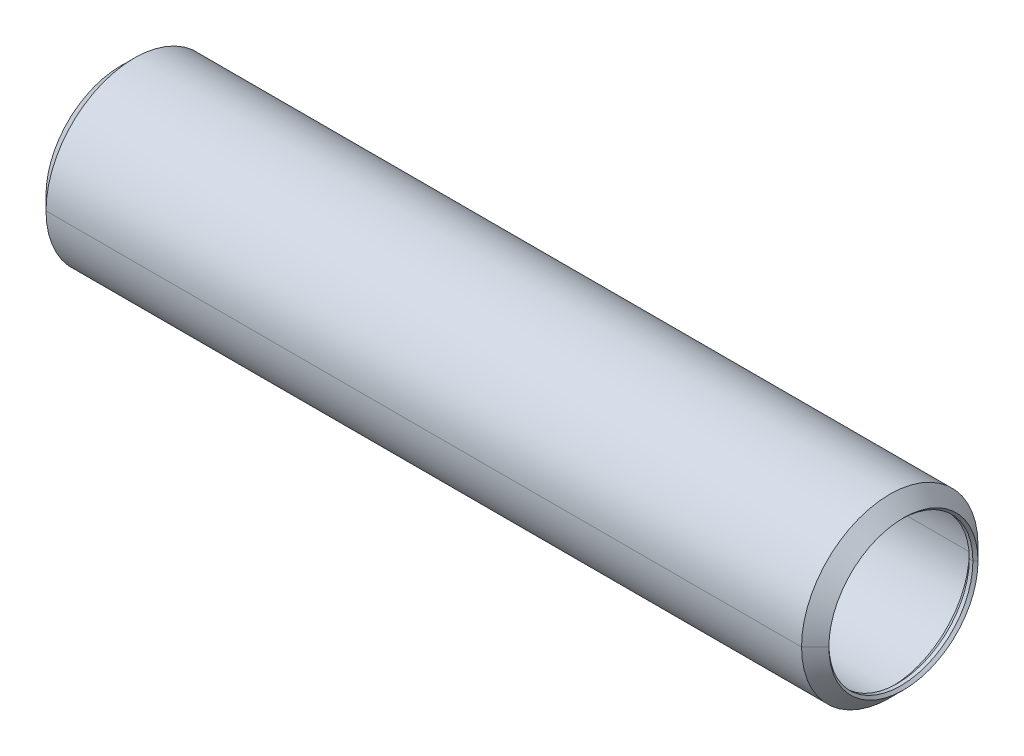
ISO-10303-21;
HEADER;
FILE_DESCRIPTION(('STEP AP214'),'2;1');
FILE_NAME('part.step','',(''),(''),'','','');
FILE_SCHEMA(('AUTOMOTIVE_DESIGN { 1 0 10303 214 1 1 1 1 }'));
ENDSEC;
DATA;
#1=APPLICATION_CONTEXT('core data for automotive mechanical design processes');
#2=APPLICATION_PROTOCOL_DEFINITION('international standard','automotive_design',2000,#1);
#3=PRODUCT_CONTEXT('',#1,'mechanical');
#4=PRODUCT('Part','Part','',(#3));
#5=PRODUCT_RELATED_PRODUCT_CATEGORY('part','',(#4));
#6=PRODUCT_DEFINITION_FORMATION('','',#4);
#7=PRODUCT_DEFINITION_CONTEXT('part definition',#1,'design');
#8=PRODUCT_DEFINITION('design','',#6,#7);
#9=PRODUCT_DEFINITION_SHAPE('','',#8);
#10=(LENGTH_UNIT() NAMED_UNIT(*) SI_UNIT(.MILLI.,.METRE.));
#11=(NAMED_UNIT(*) PLANE_ANGLE_UNIT() SI_UNIT($,.RADIAN.));
#12=(NAMED_UNIT(*) SI_UNIT($,.STERADIAN.) SOLID_ANGLE_UNIT());
#13=UNCERTAINTY_MEASURE_WITH_UNIT(LENGTH_MEASURE(1.E-05),#10,'distance_accuracy_value','');
#14=(GEOMETRIC_REPRESENTATION_CONTEXT(3) GLOBAL_UNCERTAINTY_ASSIGNED_CONTEXT((#13)) GLOBAL_UNIT_ASSIGNED_CONTEXT((#10,
#11,#12)) REPRESENTATION_CONTEXT('',''));
#15=CARTESIAN_POINT('',(0.,0.,0.));
#16=DIRECTION('',(0.,0.,1.));
#17=DIRECTION('',(1.,0.,0.));
#18=AXIS2_PLACEMENT_3D('',#15,#16,#17);
#19=CARTESIAN_POINT('',(1.69096926547172,0.,0.));
#20=DIRECTION('',(1.,0.,0.));
#21=DIRECTION('',(0.,1.,0.));
#22=AXIS2_PLACEMENT_3D('',#19,#20,#21);
#23=CONICAL_SURFACE('',#22,10.922,0.785398163397444);
#24=CARTESIAN_POINT('',(0.,0.,0.));
#25=DIRECTION('',(1.,0.,0.));
#26=DIRECTION('',(0.,0.,-1.));
#27=AXIS2_PLACEMENT_3D('',#24,#25,#26);
#28=CIRCLE('',#27,9.2310307345283);
#29=CARTESIAN_POINT('',(0.,0.,9.2310307345283));
#30=VERTEX_POINT('',#29);
#31=CARTESIAN_POINT('',(0.,0.,-9.2310307345283));
#32=VERTEX_POINT('',#31);
#33=EDGE_CURVE('E10',#30,#32,#28,.T.);
#34=ORIENTED_EDGE('',*,*,#33,.T.);
#35=CARTESIAN_POINT('',(0.,0.,-9.2310307345283));
#36=DIRECTION('',(0.707106781186551,0.,-0.707106781186544));
#37=VECTOR('',#36,1.);
#38=LINE('',#35,#37);
#39=CARTESIAN_POINT('',(1.69096926547172,0.,-10.922));
#40=VERTEX_POINT('',#39);
#41=EDGE_CURVE('E25',#32,#40,#38,.T.);
#42=ORIENTED_EDGE('',*,*,#41,.T.);
#43=CARTESIAN_POINT('',(1.69096926547172,0.,0.));
#44=DIRECTION('',(1.,0.,0.));
#45=DIRECTION('',(0.,0.,-1.));
#46=AXIS2_PLACEMENT_3D('',#43,#44,#45);
#47=CIRCLE('',#46,10.922);
#48=CARTESIAN_POINT('',(1.69096926547172,0.,10.922));
#49=VERTEX_POINT('',#48);
#50=EDGE_CURVE('E607',#49,#40,#47,.T.);
#51=ORIENTED_EDGE('',*,*,#50,.F.);
#52=CARTESIAN_POINT('',(0.,0.,9.2310307345283));
#53=DIRECTION('',(0.707106781186551,0.,0.707106781186544));
#54=VECTOR('',#53,1.);
#55=LINE('',#52,#54);
#56=EDGE_CURVE('E595',#30,#49,#55,.T.);
#57=ORIENTED_EDGE('',*,*,#56,.F.);
#58=EDGE_LOOP('',(#34,#42,#51,#57));
#59=FACE_BOUND('',#58,.T.);
#60=ADVANCED_FACE('F16',(#59),#23,.T.);
#61=CARTESIAN_POINT('',(1.69096926547172,0.,0.));
#62=DIRECTION('',(1.,0.,0.));
#63=DIRECTION('',(0.,-1.,0.));
#64=AXIS2_PLACEMENT_3D('',#61,#62,#63);
#65=CONICAL_SURFACE('',#64,10.922,0.785398163397444);
#66=CARTESIAN_POINT('',(1.69096926547172,0.,0.));
#67=DIRECTION('',(1.,0.,0.));
#68=DIRECTION('',(0.,0.,-1.));
#69=AXIS2_PLACEMENT_3D('',#66,#67,#68);
#70=CIRCLE('',#69,10.922);
#71=EDGE_CURVE('E121',#40,#49,#70,.T.);
#72=ORIENTED_EDGE('',*,*,#71,.F.);
#73=ORIENTED_EDGE('',*,*,#41,.F.);
#74=CARTESIAN_POINT('',(0.,0.,0.));
#75=DIRECTION('',(1.,0.,0.));
#76=DIRECTION('',(0.,0.,-1.));
#77=AXIS2_PLACEMENT_3D('',#74,#75,#76);
#78=CIRCLE('',#77,9.2310307345283);
#79=EDGE_CURVE('E563',#32,#30,#78,.T.);
#80=ORIENTED_EDGE('',*,*,#79,.T.);
#81=ORIENTED_EDGE('',*,*,#56,.T.);
#82=EDGE_LOOP('',(#72,#73,#80,#81));
#83=FACE_BOUND('',#82,.T.);
#84=ADVANCED_FACE('F571',(#83),#65,.T.);
#85=CARTESIAN_POINT('',(0.,0.,0.));
#86=DIRECTION('',(-1.,0.,0.));
#87=DIRECTION('',(0.,-1.,0.));
#88=AXIS2_PLACEMENT_3D('',#85,#86,#87);
#89=CONICAL_SURFACE('',#88,9.2310307345283,0.785398163397432);
#90=CARTESIAN_POINT('',(0.31563073452831,0.,0.));
#91=DIRECTION('',(1.,0.,0.));
#92=DIRECTION('',(0.,0.,-1.));
#93=AXIS2_PLACEMENT_3D('',#90,#91,#92);
#94=CIRCLE('',#93,8.9154);
#95=CARTESIAN_POINT('',(0.31563073452831,0.,-8.9154));
#96=VERTEX_POINT('',#95);
#97=CARTESIAN_POINT('',(0.315630734528312,0.,8.9154));
#98=VERTEX_POINT('',#97);
#99=EDGE_CURVE('E561',#96,#98,#94,.T.);
#100=ORIENTED_EDGE('',*,*,#99,.T.);
#101=CARTESIAN_POINT('',(0.315630734528312,0.,8.9154));
#102=DIRECTION('',(-0.707106781186559,0.,0.707106781186536));
#103=VECTOR('',#102,1.);
#104=LINE('',#101,#103);
#105=EDGE_CURVE('E539',#98,#30,#104,.T.);
#106=ORIENTED_EDGE('',*,*,#105,.T.);
#107=ORIENTED_EDGE('',*,*,#79,.F.);
#108=CARTESIAN_POINT('',(0.315630734528312,0.,-8.9154));
#109=DIRECTION('',(-0.707106781186559,0.,-0.707106781186536));
#110=VECTOR('',#109,1.);
#111=LINE('',#108,#110);
#112=EDGE_CURVE('E551',#96,#32,#111,.T.);
#113=ORIENTED_EDGE('',*,*,#112,.F.);
#114=EDGE_LOOP('',(#100,#106,#107,#113));
#115=FACE_BOUND('',#114,.T.);
#116=ADVANCED_FACE('F520',(#115),#89,.F.);
#117=CARTESIAN_POINT('',(0.,0.,0.));
#118=DIRECTION('',(-1.,0.,0.));
#119=DIRECTION('',(0.,1.,0.));
#120=AXIS2_PLACEMENT_3D('',#117,#118,#119);
#121=CONICAL_SURFACE('',#120,9.2310307345283,0.785398163397432);
#122=ORIENTED_EDGE('',*,*,#33,.F.);
#123=ORIENTED_EDGE('',*,*,#105,.F.);
#124=CARTESIAN_POINT('',(0.31563073452831,0.,0.));
#125=DIRECTION('',(1.,0.,0.));
#126=DIRECTION('',(0.,0.,-1.));
#127=AXIS2_PLACEMENT_3D('',#124,#125,#126);
#128=CIRCLE('',#127,8.9154);
#129=EDGE_CURVE('E618',#98,#96,#128,.T.);
#130=ORIENTED_EDGE('',*,*,#129,.T.);
#131=ORIENTED_EDGE('',*,*,#112,.T.);
#132=EDGE_LOOP('',(#122,#123,#130,#131));
#133=FACE_BOUND('',#132,.T.);
#134=ADVANCED_FACE('F511',(#133),#121,.F.);
#135=CARTESIAN_POINT('',(193.8274,0.,0.));
#136=DIRECTION('',(-1.,0.,0.));
#137=DIRECTION('',(0.,1.,0.));
#138=AXIS2_PLACEMENT_3D('',#135,#136,#137);
#139=CYLINDRICAL_SURFACE('',#138,8.9154);
#140=ORIENTED_EDGE('',*,*,#129,.F.);
#141=CARTESIAN_POINT('',(0.761999999999985,0.,8.9154));
#142=DIRECTION('',(-1.,0.,0.));
#143=VECTOR('',#142,1.);
#144=LINE('',#141,#143);
#145=CARTESIAN_POINT('',(0.762,0.,8.9154));
#146=VERTEX_POINT('',#145);
#147=EDGE_CURVE('E476',#146,#98,#144,.T.);
#148=ORIENTED_EDGE('',*,*,#147,.F.);
#149=CARTESIAN_POINT('',(0.762000000000013,0.,0.));
#150=DIRECTION('',(1.,0.,0.));
#151=DIRECTION('',(0.,0.,-1.));
#152=AXIS2_PLACEMENT_3D('',#149,#150,#151);
#153=CIRCLE('',#152,8.9154);
#154=CARTESIAN_POINT('',(0.762000000000013,0.,-8.9154));
#155=VERTEX_POINT('',#154);
#156=EDGE_CURVE('E493',#146,#155,#153,.T.);
#157=ORIENTED_EDGE('',*,*,#156,.T.);
#158=CARTESIAN_POINT('',(0.761999999999985,0.,-8.9154));
#159=DIRECTION('',(-1.,0.,0.));
#160=VECTOR('',#159,1.);
#161=LINE('',#158,#160);
#162=EDGE_CURVE('E478',#155,#96,#161,.T.);
#163=ORIENTED_EDGE('',*,*,#162,.T.);
#164=EDGE_LOOP('',(#140,#148,#157,#163));
#165=FACE_BOUND('',#164,.T.);
#166=ADVANCED_FACE('F459',(#165),#139,.F.);
#167=CARTESIAN_POINT('',(193.8274,0.,0.));
#168=DIRECTION('',(-1.,0.,0.));
#169=DIRECTION('',(0.,-1.,0.));
#170=AXIS2_PLACEMENT_3D('',#167,#168,#169);
#171=CYLINDRICAL_SURFACE('',#170,8.9154);
#172=CARTESIAN_POINT('',(0.762000000000013,0.,0.));
#173=DIRECTION('',(1.,0.,0.));
#174=DIRECTION('',(0.,0.,-1.));
#175=AXIS2_PLACEMENT_3D('',#172,#173,#174);
#176=CIRCLE('',#175,8.9154);
#177=EDGE_CURVE('E442',#155,#146,#176,.T.);
#178=ORIENTED_EDGE('',*,*,#177,.T.);
#179=ORIENTED_EDGE('',*,*,#147,.T.);
#180=ORIENTED_EDGE('',*,*,#99,.F.);
#181=ORIENTED_EDGE('',*,*,#162,.F.);
#182=EDGE_LOOP('',(#178,#179,#180,#181));
#183=FACE_BOUND('',#182,.T.);
#184=ADVANCED_FACE('F450',(#183),#171,.F.);
#185=CARTESIAN_POINT('',(0.762000000000013,0.,0.));
#186=DIRECTION('',(1.,0.,0.));
#187=DIRECTION('',(0.,-1.,0.));
#188=AXIS2_PLACEMENT_3D('',#185,#186,#187);
#189=CONICAL_SURFACE('',#188,8.9154,0.785398163397459);
#190=CARTESIAN_POINT('',(1.524,0.,0.));
#191=DIRECTION('',(1.,0.,0.));
#192=DIRECTION('',(0.,0.,-1.));
#193=AXIS2_PLACEMENT_3D('',#190,#191,#192);
#194=CIRCLE('',#193,9.6774);
#195=CARTESIAN_POINT('',(1.524,0.,-9.6774));
#196=VERTEX_POINT('',#195);
#197=CARTESIAN_POINT('',(1.524,0.,9.6774));
#198=VERTEX_POINT('',#197);
#199=EDGE_CURVE('E440',#196,#198,#194,.T.);
#200=ORIENTED_EDGE('',*,*,#199,.T.);
#201=CARTESIAN_POINT('',(0.762000000000013,0.,8.9154));
#202=DIRECTION('',(0.70710678118654,0.,0.707106781186555));
#203=VECTOR('',#202,1.);
#204=LINE('',#201,#203);
#205=EDGE_CURVE('E418',#146,#198,#204,.T.);
#206=ORIENTED_EDGE('',*,*,#205,.F.);
#207=ORIENTED_EDGE('',*,*,#177,.F.);
#208=CARTESIAN_POINT('',(0.762000000000013,0.,-8.9154));
#209=DIRECTION('',(0.70710678118654,0.,-0.707106781186555));
#210=VECTOR('',#209,1.);
#211=LINE('',#208,#210);
#212=EDGE_CURVE('E430',#155,#196,#211,.T.);
#213=ORIENTED_EDGE('',*,*,#212,.T.);
#214=EDGE_LOOP('',(#200,#206,#207,#213));
#215=FACE_BOUND('',#214,.T.);
#216=ADVANCED_FACE('F397',(#215),#189,.F.);
#217=CARTESIAN_POINT('',(0.762000000000013,0.,0.));
#218=DIRECTION('',(1.,0.,0.));
#219=DIRECTION('',(0.,1.,0.));
#220=AXIS2_PLACEMENT_3D('',#217,#218,#219);
#221=CONICAL_SURFACE('',#220,8.9154,0.785398163397459);
#222=ORIENTED_EDGE('',*,*,#156,.F.);
#223=ORIENTED_EDGE('',*,*,#205,.T.);
#224=CARTESIAN_POINT('',(1.524,0.,0.));
#225=DIRECTION('',(1.,0.,0.));
#226=DIRECTION('',(0.,0.,-1.));
#227=AXIS2_PLACEMENT_3D('',#224,#225,#226);
#228=CIRCLE('',#227,9.6774);
#229=EDGE_CURVE('E866',#198,#196,#228,.T.);
#230=ORIENTED_EDGE('',*,*,#229,.T.);
#231=ORIENTED_EDGE('',*,*,#212,.F.);
#232=EDGE_LOOP('',(#222,#223,#230,#231));
#233=FACE_BOUND('',#232,.T.);
#234=ADVANCED_FACE('F388',(#233),#221,.F.);
#235=CARTESIAN_POINT('',(193.8274,0.,0.));
#236=DIRECTION('',(-1.,0.,0.));
#237=DIRECTION('',(0.,1.,0.));
#238=AXIS2_PLACEMENT_3D('',#235,#236,#237);
#239=CYLINDRICAL_SURFACE('',#238,9.6774);
#240=ORIENTED_EDGE('',*,*,#229,.F.);
#241=CARTESIAN_POINT('',(95.3897,0.,9.6774));
#242=DIRECTION('',(-1.,0.,0.));
#243=VECTOR('',#242,1.);
#244=LINE('',#241,#243);
#245=CARTESIAN_POINT('',(95.3897,0.,9.6774));
#246=VERTEX_POINT('',#245);
#247=EDGE_CURVE('E353',#246,#198,#244,.T.);
#248=ORIENTED_EDGE('',*,*,#247,.F.);
#249=CARTESIAN_POINT('',(95.3897,0.,0.));
#250=DIRECTION('',(1.,0.,0.));
#251=DIRECTION('',(0.,0.,-1.));
#252=AXIS2_PLACEMENT_3D('',#249,#250,#251);
#253=CIRCLE('',#252,9.6774);
#254=CARTESIAN_POINT('',(95.3897,0.,-9.6774));
#255=VERTEX_POINT('',#254);
#256=EDGE_CURVE('E370',#246,#255,#253,.T.);
#257=ORIENTED_EDGE('',*,*,#256,.T.);
#258=CARTESIAN_POINT('',(95.3897,0.,-9.6774));
#259=DIRECTION('',(-1.,0.,0.));
#260=VECTOR('',#259,1.);
#261=LINE('',#258,#260);
#262=EDGE_CURVE('E355',#255,#196,#261,.T.);
#263=ORIENTED_EDGE('',*,*,#262,.T.);
#264=EDGE_LOOP('',(#240,#248,#257,#263));
#265=FACE_BOUND('',#264,.T.);
#266=ADVANCED_FACE('F336',(#265),#239,.F.);
#267=CARTESIAN_POINT('',(193.8274,0.,0.));
#268=DIRECTION('',(-1.,0.,0.));
#269=DIRECTION('',(0.,-1.,0.));
#270=AXIS2_PLACEMENT_3D('',#267,#268,#269);
#271=CYLINDRICAL_SURFACE('',#270,9.6774);
#272=CARTESIAN_POINT('',(95.3897,0.,0.));
#273=DIRECTION('',(1.,0.,0.));
#274=DIRECTION('',(0.,0.,-1.));
#275=AXIS2_PLACEMENT_3D('',#272,#273,#274);
#276=CIRCLE('',#275,9.6774);
#277=EDGE_CURVE('E319',#255,#246,#276,.T.);
#278=ORIENTED_EDGE('',*,*,#277,.T.);
#279=ORIENTED_EDGE('',*,*,#247,.T.);
#280=ORIENTED_EDGE('',*,*,#199,.F.);
#281=ORIENTED_EDGE('',*,*,#262,.F.);
#282=EDGE_LOOP('',(#278,#279,#280,#281));
#283=FACE_BOUND('',#282,.T.);
#284=ADVANCED_FACE('F327',(#283),#271,.F.);
#285=CARTESIAN_POINT('',(95.3897,0.,0.));
#286=DIRECTION('',(-1.,0.,0.));
#287=DIRECTION('',(0.,-1.,0.));
#288=AXIS2_PLACEMENT_3D('',#285,#286,#287);
#289=CONICAL_SURFACE('',#288,9.6774,0.78539816339745);
#290=CARTESIAN_POINT('',(96.1517,0.,0.));
#291=DIRECTION('',(1.,0.,0.));
#292=DIRECTION('',(0.,0.,-1.));
#293=AXIS2_PLACEMENT_3D('',#290,#291,#292);
#294=CIRCLE('',#293,8.9154);
#295=CARTESIAN_POINT('',(96.1517,0.,-8.9154));
#296=VERTEX_POINT('',#295);
#297=CARTESIAN_POINT('',(96.1517,0.,8.9154));
#298=VERTEX_POINT('',#297);
#299=EDGE_CURVE('E317',#296,#298,#294,.T.);
#300=ORIENTED_EDGE('',*,*,#299,.T.);
#301=CARTESIAN_POINT('',(96.1517,0.,8.9154));
#302=DIRECTION('',(-0.707106781186546,0.,0.707106781186549));
#303=VECTOR('',#302,1.);
#304=LINE('',#301,#303);
#305=EDGE_CURVE('E295',#298,#246,#304,.T.);
#306=ORIENTED_EDGE('',*,*,#305,.T.);
#307=ORIENTED_EDGE('',*,*,#277,.F.);
#308=CARTESIAN_POINT('',(96.1517,0.,-8.9154));
#309=DIRECTION('',(-0.707106781186546,0.,-0.707106781186549));
#310=VECTOR('',#309,1.);
#311=LINE('',#308,#310);
#312=EDGE_CURVE('E307',#296,#255,#311,.T.);
#313=ORIENTED_EDGE('',*,*,#312,.F.);
#314=EDGE_LOOP('',(#300,#306,#307,#313));
#315=FACE_BOUND('',#314,.T.);
#316=ADVANCED_FACE('F274',(#315),#289,.F.);
#317=CARTESIAN_POINT('',(95.3897,0.,0.));
#318=DIRECTION('',(-1.,0.,0.));
#319=DIRECTION('',(0.,1.,0.));
#320=AXIS2_PLACEMENT_3D('',#317,#318,#319);
#321=CONICAL_SURFACE('',#320,9.6774,0.78539816339745);
#322=ORIENTED_EDGE('',*,*,#256,.F.);
#323=ORIENTED_EDGE('',*,*,#305,.F.);
#324=CARTESIAN_POINT('',(96.1517,0.,0.));
#325=DIRECTION('',(1.,0.,0.));
#326=DIRECTION('',(0.,0.,-1.));
#327=AXIS2_PLACEMENT_3D('',#324,#325,#326);
#328=CIRCLE('',#327,8.9154);
#329=EDGE_CURVE('E865',#298,#296,#328,.T.);
#330=ORIENTED_EDGE('',*,*,#329,.T.);
#331=ORIENTED_EDGE('',*,*,#312,.T.);
#332=EDGE_LOOP('',(#322,#323,#330,#331));
#333=FACE_BOUND('',#332,.T.);
#334=ADVANCED_FACE('F265',(#333),#321,.F.);
#335=CARTESIAN_POINT('',(193.8274,0.,0.));
#336=DIRECTION('',(-1.,0.,0.));
#337=DIRECTION('',(0.,1.,0.));
#338=AXIS2_PLACEMENT_3D('',#335,#336,#337);
#339=CYLINDRICAL_SURFACE('',#338,8.9154);
#340=ORIENTED_EDGE('',*,*,#329,.F.);
#341=CARTESIAN_POINT('',(96.598069265472,0.,8.9154));
#342=DIRECTION('',(-1.,0.,0.));
#343=VECTOR('',#342,1.);
#344=LINE('',#341,#343);
#345=CARTESIAN_POINT('',(96.598069265472,0.,8.9154));
#346=VERTEX_POINT('',#345);
#347=EDGE_CURVE('E230',#346,#298,#344,.T.);
#348=ORIENTED_EDGE('',*,*,#347,.F.);
#349=CARTESIAN_POINT('',(96.598069265472,0.,0.));
#350=DIRECTION('',(1.,0.,0.));
#351=DIRECTION('',(0.,0.,-1.));
#352=AXIS2_PLACEMENT_3D('',#349,#350,#351);
#353=CIRCLE('',#352,8.9154);
#354=CARTESIAN_POINT('',(96.598069265472,0.,-8.9154));
#355=VERTEX_POINT('',#354);
#356=EDGE_CURVE('E247',#346,#355,#353,.T.);
#357=ORIENTED_EDGE('',*,*,#356,.T.);
#358=CARTESIAN_POINT('',(96.598069265472,0.,-8.9154));
#359=DIRECTION('',(-1.,0.,0.));
#360=VECTOR('',#359,1.);
#361=LINE('',#358,#360);
#362=EDGE_CURVE('E232',#355,#296,#361,.T.);
#363=ORIENTED_EDGE('',*,*,#362,.T.);
#364=EDGE_LOOP('',(#340,#348,#357,#363));
#365=FACE_BOUND('',#364,.T.);
#366=ADVANCED_FACE('F213',(#365),#339,.F.);
#367=CARTESIAN_POINT('',(193.8274,0.,0.));
#368=DIRECTION('',(-1.,0.,0.));
#369=DIRECTION('',(0.,-1.,0.));
#370=AXIS2_PLACEMENT_3D('',#367,#368,#369);
#371=CYLINDRICAL_SURFACE('',#370,8.9154);
#372=CARTESIAN_POINT('',(96.598069265472,0.,0.));
#373=DIRECTION('',(1.,0.,0.));
#374=DIRECTION('',(0.,0.,-1.));
#375=AXIS2_PLACEMENT_3D('',#372,#373,#374);
#376=CIRCLE('',#375,8.9154);
#377=EDGE_CURVE('E196',#355,#346,#376,.T.);
#378=ORIENTED_EDGE('',*,*,#377,.T.);
#379=ORIENTED_EDGE('',*,*,#347,.T.);
#380=ORIENTED_EDGE('',*,*,#299,.F.);
#381=ORIENTED_EDGE('',*,*,#362,.F.);
#382=EDGE_LOOP('',(#378,#379,#380,#381));
#383=FACE_BOUND('',#382,.T.);
#384=ADVANCED_FACE('F204',(#383),#371,.F.);
#385=CARTESIAN_POINT('',(96.598069265472,0.,0.));
#386=DIRECTION('',(1.,0.,0.));
#387=DIRECTION('',(0.,-1.,0.));
#388=AXIS2_PLACEMENT_3D('',#385,#386,#387);
#389=CONICAL_SURFACE('',#388,8.9154,0.785398163397937);
#390=CARTESIAN_POINT('',(96.9137,0.,0.));
#391=DIRECTION('',(1.,0.,0.));
#392=DIRECTION('',(0.,0.,-1.));
#393=AXIS2_PLACEMENT_3D('',#390,#391,#392);
#394=CIRCLE('',#393,9.2310307345283);
#395=CARTESIAN_POINT('',(96.9137,0.,-9.2310307345283));
#396=VERTEX_POINT('',#395);
#397=CARTESIAN_POINT('',(96.9137,0.,9.23103073452828));
#398=VERTEX_POINT('',#397);
#399=EDGE_CURVE('E194',#396,#398,#394,.T.);
#400=ORIENTED_EDGE('',*,*,#399,.T.);
#401=CARTESIAN_POINT('',(96.598069265472,0.,8.9154));
#402=DIRECTION('',(0.707106781186204,0.,0.707106781186892));
#403=VECTOR('',#402,1.);
#404=LINE('',#401,#403);
#405=EDGE_CURVE('E173',#346,#398,#404,.T.);
#406=ORIENTED_EDGE('',*,*,#405,.F.);
#407=ORIENTED_EDGE('',*,*,#377,.F.);
#408=CARTESIAN_POINT('',(96.598069265472,0.,-8.9154));
#409=DIRECTION('',(0.707106781186204,0.,-0.707106781186892));
#410=VECTOR('',#409,1.);
#411=LINE('',#408,#410);
#412=EDGE_CURVE('E130',#355,#396,#411,.T.);
#413=ORIENTED_EDGE('',*,*,#412,.T.);
#414=EDGE_LOOP('',(#400,#406,#407,#413));
#415=FACE_BOUND('',#414,.T.);
#416=ADVANCED_FACE('F151',(#415),#389,.F.);
#417=CARTESIAN_POINT('',(96.598069265472,0.,0.));
#418=DIRECTION('',(1.,0.,0.));
#419=DIRECTION('',(0.,1.,0.));
#420=AXIS2_PLACEMENT_3D('',#417,#418,#419);
#421=CONICAL_SURFACE('',#420,8.9154,0.785398163397937);
#422=ORIENTED_EDGE('',*,*,#356,.F.);
#423=ORIENTED_EDGE('',*,*,#405,.T.);
#424=CARTESIAN_POINT('',(96.9137,0.,0.));
#425=DIRECTION('',(1.,0.,0.));
#426=DIRECTION('',(0.,0.,-1.));
#427=AXIS2_PLACEMENT_3D('',#424,#425,#426);
#428=CIRCLE('',#427,9.2310307345283);
#429=EDGE_CURVE('E99',#398,#396,#428,.T.);
#430=ORIENTED_EDGE('',*,*,#429,.T.);
#431=ORIENTED_EDGE('',*,*,#412,.F.);
#432=EDGE_LOOP('',(#422,#423,#430,#431));
#433=FACE_BOUND('',#432,.T.);
#434=ADVANCED_FACE('F141',(#433),#421,.F.);
#435=CARTESIAN_POINT('',(96.9137,0.,0.));
#436=DIRECTION('',(-1.,0.,0.));
#437=DIRECTION('',(0.,1.,0.));
#438=AXIS2_PLACEMENT_3D('',#435,#436,#437);
#439=CONICAL_SURFACE('',#438,9.2310307345283,0.785398163397358);
#440=CARTESIAN_POINT('',(95.222730734528,0.,0.));
#441=DIRECTION('',(1.,0.,0.));
#442=DIRECTION('',(0.,0.,-1.));
#443=AXIS2_PLACEMENT_3D('',#440,#441,#442);
#444=CIRCLE('',#443,10.922);
#445=CARTESIAN_POINT('',(95.222730734528,0.,10.922));
#446=VERTEX_POINT('',#445);
#447=CARTESIAN_POINT('',(95.222730734528,0.,-10.922));
#448=VERTEX_POINT('',#447);
#449=EDGE_CURVE('E96',#446,#448,#444,.T.);
#450=ORIENTED_EDGE('',*,*,#449,.T.);
#451=CARTESIAN_POINT('',(96.9137,0.,-9.2310307345283));
#452=DIRECTION('',(-0.707106781186612,0.,-0.707106781186483));
#453=VECTOR('',#452,1.);
#454=LINE('',#451,#453);
#455=EDGE_CURVE('E103',#396,#448,#454,.T.);
#456=ORIENTED_EDGE('',*,*,#455,.F.);
#457=ORIENTED_EDGE('',*,*,#429,.F.);
#458=CARTESIAN_POINT('',(96.9137,0.,9.2310307345283));
#459=DIRECTION('',(-0.707106781186612,0.,0.707106781186483));
#460=VECTOR('',#459,1.);
#461=LINE('',#458,#460);
#462=EDGE_CURVE('E90',#398,#446,#461,.T.);
#463=ORIENTED_EDGE('',*,*,#462,.T.);
#464=EDGE_LOOP('',(#450,#456,#457,#463));
#465=FACE_BOUND('',#464,.T.);
#466=ADVANCED_FACE('F93',(#465),#439,.T.);
#467=CARTESIAN_POINT('',(96.9137,0.,0.));
#468=DIRECTION('',(-1.,0.,0.));
#469=DIRECTION('',(0.,-1.,0.));
#470=AXIS2_PLACEMENT_3D('',#467,#468,#469);
#471=CONICAL_SURFACE('',#470,9.2310307345283,0.785398163397358);
#472=ORIENTED_EDGE('',*,*,#399,.F.);
#473=ORIENTED_EDGE('',*,*,#455,.T.);
#474=CARTESIAN_POINT('',(95.222730734528,0.,0.));
#475=DIRECTION('',(1.,0.,0.));
#476=DIRECTION('',(0.,0.,-1.));
#477=AXIS2_PLACEMENT_3D('',#474,#475,#476);
#478=CIRCLE('',#477,10.922);
#479=EDGE_CURVE('E104',#448,#446,#478,.T.);
#480=ORIENTED_EDGE('',*,*,#479,.T.);
#481=ORIENTED_EDGE('',*,*,#462,.F.);
#482=EDGE_LOOP('',(#472,#473,#480,#481));
#483=FACE_BOUND('',#482,.T.);
#484=ADVANCED_FACE('F109',(#483),#471,.T.);
#485=CARTESIAN_POINT('',(193.8274,0.,0.));
#486=DIRECTION('',(-1.,0.,0.));
#487=DIRECTION('',(0.,-1.,0.));
#488=AXIS2_PLACEMENT_3D('',#485,#486,#487);
#489=CYLINDRICAL_SURFACE('',#488,10.922);
#490=ORIENTED_EDGE('',*,*,#479,.F.);
#491=CARTESIAN_POINT('',(95.222730734528,0.,-10.922));
#492=DIRECTION('',(-1.,0.,0.));
#493=VECTOR('',#492,1.);
#494=LINE('',#491,#493);
#495=EDGE_CURVE('E114',#448,#40,#494,.T.);
#496=ORIENTED_EDGE('',*,*,#495,.T.);
#497=ORIENTED_EDGE('',*,*,#71,.T.);
#498=CARTESIAN_POINT('',(95.222730734528,0.,10.922));
#499=DIRECTION('',(-1.,0.,0.));
#500=VECTOR('',#499,1.);
#501=LINE('',#498,#500);
#502=EDGE_CURVE('E118',#446,#49,#501,.T.);
#503=ORIENTED_EDGE('',*,*,#502,.F.);
#504=EDGE_LOOP('',(#490,#496,#497,#503));
#505=FACE_BOUND('',#504,.T.);
#506=ADVANCED_FACE('F120',(#505),#489,.T.);
#507=CARTESIAN_POINT('',(193.8274,0.,0.));
#508=DIRECTION('',(-1.,0.,0.));
#509=DIRECTION('',(0.,1.,0.));
#510=AXIS2_PLACEMENT_3D('',#507,#508,#509);
#511=CYLINDRICAL_SURFACE('',#510,10.922);
#512=ORIENTED_EDGE('',*,*,#50,.T.);
#513=ORIENTED_EDGE('',*,*,#495,.F.);
#514=ORIENTED_EDGE('',*,*,#449,.F.);
#515=ORIENTED_EDGE('',*,*,#502,.T.);
#516=EDGE_LOOP('',(#512,#513,#514,#515));
#517=FACE_BOUND('',#516,.T.);
#518=ADVANCED_FACE('F127',(#517),#511,.T.);
#519=CLOSED_SHELL('',(#60,#84,#116,#134,#166,#184,#216,#234,#266,#284,#316,#334,#366,#384,#416,
#434,#466,#484,#506,#518));
#520=MANIFOLD_SOLID_BREP('B1',#519);
#521=ADVANCED_BREP_SHAPE_REPRESENTATION('',(#18,#520),#14);
#522=SHAPE_DEFINITION_REPRESENTATION(#9,#521);
ENDSEC;
END-ISO-10303-21;
